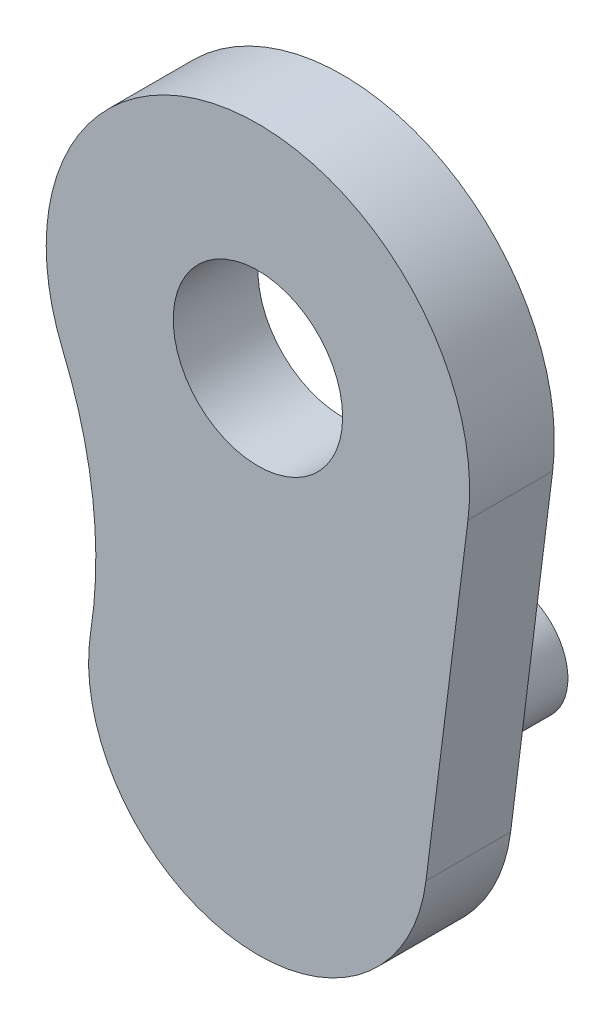
ISO-10303-21;
HEADER;
FILE_DESCRIPTION(('STEP AP214'),'2;1');
FILE_NAME('part.step','',(''),(''),'','','');
FILE_SCHEMA(('AUTOMOTIVE_DESIGN { 1 0 10303 214 1 1 1 1 }'));
ENDSEC;
DATA;
#1=APPLICATION_CONTEXT('core data for automotive mechanical design processes');
#2=APPLICATION_PROTOCOL_DEFINITION('international standard','automotive_design',2000,#1);
#3=PRODUCT_CONTEXT('',#1,'mechanical');
#4=PRODUCT('Part','Part','',(#3));
#5=PRODUCT_RELATED_PRODUCT_CATEGORY('part','',(#4));
#6=PRODUCT_DEFINITION_FORMATION('','',#4);
#7=PRODUCT_DEFINITION_CONTEXT('part definition',#1,'design');
#8=PRODUCT_DEFINITION('design','',#6,#7);
#9=PRODUCT_DEFINITION_SHAPE('','',#8);
#10=(LENGTH_UNIT() NAMED_UNIT(*) SI_UNIT(.MILLI.,.METRE.));
#11=(NAMED_UNIT(*) PLANE_ANGLE_UNIT() SI_UNIT($,.RADIAN.));
#12=(NAMED_UNIT(*) SI_UNIT($,.STERADIAN.) SOLID_ANGLE_UNIT());
#13=UNCERTAINTY_MEASURE_WITH_UNIT(LENGTH_MEASURE(1.E-05),#10,'distance_accuracy_value','');
#14=(GEOMETRIC_REPRESENTATION_CONTEXT(3) GLOBAL_UNCERTAINTY_ASSIGNED_CONTEXT((#13)) GLOBAL_UNIT_ASSIGNED_CONTEXT((#10,
#11,#12)) REPRESENTATION_CONTEXT('',''));
#15=CARTESIAN_POINT('',(0.,0.,0.));
#16=DIRECTION('',(0.,0.,1.));
#17=DIRECTION('',(1.,0.,0.));
#18=AXIS2_PLACEMENT_3D('',#15,#16,#17);
#19=CARTESIAN_POINT('',(-69.1402277530961,-29.0625,10.));
#20=DIRECTION('',(0.,0.,-1.));
#21=DIRECTION('',(-1.,0.,0.));
#22=AXIS2_PLACEMENT_3D('',#19,#20,#21);
#23=PLANE('',#22);
#24=CARTESIAN_POINT('',(-69.1402277530961,-29.0625,10.));
#25=DIRECTION('',(0.,0.,-1.));
#26=DIRECTION('',(-1.,0.,0.));
#27=AXIS2_PLACEMENT_3D('',#24,#25,#26);
#28=CIRCLE('',#27,50.);
#29=CARTESIAN_POINT('',(-23.0467425843654,-9.68749999999997,10.));
#30=VERTEX_POINT('',#29);
#31=CARTESIAN_POINT('',(-19.7543507865989,-36.875,10.));
#32=VERTEX_POINT('',#31);
#33=EDGE_CURVE('E92',#30,#32,#28,.T.);
#34=ORIENTED_EDGE('',*,*,#33,.T.);
#35=CARTESIAN_POINT('',(0.,-40.,10.));
#36=DIRECTION('',(0.,0.,1.));
#37=DIRECTION('',(1.,0.,0.));
#38=AXIS2_PLACEMENT_3D('',#35,#36,#37);
#39=CIRCLE('',#38,20.);
#40=CARTESIAN_POINT('',(19.8431348329844,-42.5,10.));
#41=VERTEX_POINT('',#40);
#42=EDGE_CURVE('E87',#32,#41,#39,.T.);
#43=ORIENTED_EDGE('',*,*,#42,.T.);
#44=DIRECTION('',(0.125,0.992156741649222,0.));
#45=VECTOR('',#44,1.);
#46=CARTESIAN_POINT('',(24.8039185412305,-3.125,10.));
#47=LINE('',#46,#45);
#48=CARTESIAN_POINT('',(24.8039185412305,-3.12500000000001,10.));
#49=VERTEX_POINT('',#48);
#50=EDGE_CURVE('E90',#41,#49,#47,.T.);
#51=ORIENTED_EDGE('',*,*,#50,.T.);
#52=CARTESIAN_POINT('',(0.,0.,10.));
#53=DIRECTION('',(0.,0.,1.));
#54=DIRECTION('',(1.,0.,0.));
#55=AXIS2_PLACEMENT_3D('',#52,#53,#54);
#56=CIRCLE('',#55,25.);
#57=EDGE_CURVE('E57',#49,#30,#56,.T.);
#58=ORIENTED_EDGE('',*,*,#57,.T.);
#59=EDGE_LOOP('',(#34,#43,#51,#58));
#60=FACE_BOUND('',#59,.T.);
#61=CARTESIAN_POINT('',(0.,0.,10.));
#62=DIRECTION('',(0.,0.,1.));
#63=DIRECTION('',(1.,0.,0.));
#64=AXIS2_PLACEMENT_3D('',#61,#62,#63);
#65=CIRCLE('',#64,10.);
#66=CARTESIAN_POINT('',(10.,0.,10.));
#67=VERTEX_POINT('',#66);
#68=EDGE_CURVE('E112',#67,#67,#65,.T.);
#69=ORIENTED_EDGE('',*,*,#68,.F.);
#70=EDGE_LOOP('',(#69));
#71=FACE_BOUND('',#70,.T.);
#72=ADVANCED_FACE('F39',(#60,#71),#23,.F.);
#73=CARTESIAN_POINT('',(-69.1402277530961,-29.0625,0.));
#74=DIRECTION('',(0.,0.,-1.));
#75=DIRECTION('',(-1.,0.,0.));
#76=AXIS2_PLACEMENT_3D('',#73,#74,#75);
#77=PLANE('',#76);
#78=CARTESIAN_POINT('',(0.,-43.4319526427061,0.));
#79=DIRECTION('',(0.,0.,-1.));
#80=DIRECTION('',(-1.,0.,0.));
#81=AXIS2_PLACEMENT_3D('',#78,#79,#80);
#82=CIRCLE('',#81,6.59982996803205);
#83=CARTESIAN_POINT('',(-6.59982996803205,-43.4319526427061,0.));
#84=VERTEX_POINT('',#83);
#85=EDGE_CURVE('E138',#84,#84,#82,.T.);
#86=ORIENTED_EDGE('',*,*,#85,.F.);
#87=EDGE_LOOP('',(#86));
#88=FACE_BOUND('',#87,.T.);
#89=CARTESIAN_POINT('',(-69.1402277530961,-29.0625,0.));
#90=DIRECTION('',(0.,0.,-1.));
#91=DIRECTION('',(-1.,0.,0.));
#92=AXIS2_PLACEMENT_3D('',#89,#90,#91);
#93=CIRCLE('',#92,50.);
#94=CARTESIAN_POINT('',(-23.0467425843654,-9.68749999999997,0.));
#95=VERTEX_POINT('',#94);
#96=CARTESIAN_POINT('',(-19.7543507865989,-36.875,0.));
#97=VERTEX_POINT('',#96);
#98=EDGE_CURVE('E108',#95,#97,#93,.T.);
#99=ORIENTED_EDGE('',*,*,#98,.F.);
#100=CARTESIAN_POINT('',(0.,0.,0.));
#101=DIRECTION('',(0.,0.,1.));
#102=DIRECTION('',(1.,0.,0.));
#103=AXIS2_PLACEMENT_3D('',#100,#101,#102);
#104=CIRCLE('',#103,25.);
#105=CARTESIAN_POINT('',(24.8039185412305,-3.12500000000001,0.));
#106=VERTEX_POINT('',#105);
#107=EDGE_CURVE('E80',#106,#95,#104,.T.);
#108=ORIENTED_EDGE('',*,*,#107,.F.);
#109=DIRECTION('',(0.125,0.992156741649222,0.));
#110=VECTOR('',#109,1.);
#111=CARTESIAN_POINT('',(24.8039185412305,-3.125,0.));
#112=LINE('',#111,#110);
#113=CARTESIAN_POINT('',(19.8431348329844,-42.5,0.));
#114=VERTEX_POINT('',#113);
#115=EDGE_CURVE('E74',#114,#106,#112,.T.);
#116=ORIENTED_EDGE('',*,*,#115,.F.);
#117=CARTESIAN_POINT('',(0.,-40.,0.));
#118=DIRECTION('',(0.,0.,1.));
#119=DIRECTION('',(1.,0.,0.));
#120=AXIS2_PLACEMENT_3D('',#117,#118,#119);
#121=CIRCLE('',#120,20.);
#122=EDGE_CURVE('E97',#97,#114,#121,.T.);
#123=ORIENTED_EDGE('',*,*,#122,.F.);
#124=EDGE_LOOP('',(#99,#108,#116,#123));
#125=FACE_BOUND('',#124,.T.);
#126=CARTESIAN_POINT('',(0.,0.,0.));
#127=DIRECTION('',(0.,0.,1.));
#128=DIRECTION('',(1.,0.,0.));
#129=AXIS2_PLACEMENT_3D('',#126,#127,#128);
#130=CIRCLE('',#129,10.);
#131=CARTESIAN_POINT('',(10.,0.,0.));
#132=VERTEX_POINT('',#131);
#133=EDGE_CURVE('E130',#132,#132,#130,.T.);
#134=ORIENTED_EDGE('',*,*,#133,.T.);
#135=EDGE_LOOP('',(#134));
#136=FACE_BOUND('',#135,.T.);
#137=ADVANCED_FACE('F125',(#88,#125,#136),#77,.T.);
#138=CARTESIAN_POINT('',(-69.1402277530961,-29.0625,10.));
#139=DIRECTION('',(0.,0.,-1.));
#140=DIRECTION('',(-1.,0.,0.));
#141=AXIS2_PLACEMENT_3D('',#138,#139,#140);
#142=CYLINDRICAL_SURFACE('',#141,50.);
#143=ORIENTED_EDGE('',*,*,#98,.T.);
#144=DIRECTION('',(0.,0.,-1.));
#145=VECTOR('',#144,1.);
#146=CARTESIAN_POINT('',(-19.7543507865989,-36.875,10.));
#147=LINE('',#146,#145);
#148=EDGE_CURVE('E11',#32,#97,#147,.T.);
#149=ORIENTED_EDGE('',*,*,#148,.F.);
#150=ORIENTED_EDGE('',*,*,#33,.F.);
#151=DIRECTION('',(0.,0.,-1.));
#152=VECTOR('',#151,1.);
#153=CARTESIAN_POINT('',(-23.0467425843654,-9.68749999999997,10.));
#154=LINE('',#153,#152);
#155=EDGE_CURVE('E104',#30,#95,#154,.T.);
#156=ORIENTED_EDGE('',*,*,#155,.T.);
#157=EDGE_LOOP('',(#143,#149,#150,#156));
#158=FACE_BOUND('',#157,.T.);
#159=ADVANCED_FACE('F41',(#158),#142,.F.);
#160=CARTESIAN_POINT('',(0.,-40.,10.));
#161=DIRECTION('',(0.,0.,-1.));
#162=DIRECTION('',(-1.,0.,0.));
#163=AXIS2_PLACEMENT_3D('',#160,#161,#162);
#164=CYLINDRICAL_SURFACE('',#163,20.);
#165=ORIENTED_EDGE('',*,*,#122,.T.);
#166=DIRECTION('',(0.,0.,-1.));
#167=VECTOR('',#166,1.);
#168=CARTESIAN_POINT('',(19.8431348329844,-42.5,10.));
#169=LINE('',#168,#167);
#170=EDGE_CURVE('E49',#41,#114,#169,.T.);
#171=ORIENTED_EDGE('',*,*,#170,.F.);
#172=ORIENTED_EDGE('',*,*,#42,.F.);
#173=ORIENTED_EDGE('',*,*,#148,.T.);
#174=EDGE_LOOP('',(#165,#171,#172,#173));
#175=FACE_BOUND('',#174,.T.);
#176=ADVANCED_FACE('F96',(#175),#164,.T.);
#177=CARTESIAN_POINT('',(24.8039185412305,-3.125,10.));
#178=DIRECTION('',(-0.992156741649222,0.125,0.));
#179=DIRECTION('',(-0.125,-0.992156741649222,0.));
#180=AXIS2_PLACEMENT_3D('',#177,#178,#179);
#181=PLANE('',#180);
#182=ORIENTED_EDGE('',*,*,#115,.T.);
#183=DIRECTION('',(0.,0.,-1.));
#184=VECTOR('',#183,1.);
#185=CARTESIAN_POINT('',(24.8039185412305,-3.12500000000001,10.));
#186=LINE('',#185,#184);
#187=EDGE_CURVE('E99',#49,#106,#186,.T.);
#188=ORIENTED_EDGE('',*,*,#187,.F.);
#189=ORIENTED_EDGE('',*,*,#50,.F.);
#190=ORIENTED_EDGE('',*,*,#170,.T.);
#191=EDGE_LOOP('',(#182,#188,#189,#190));
#192=FACE_BOUND('',#191,.T.);
#193=ADVANCED_FACE('F100',(#192),#181,.F.);
#194=CARTESIAN_POINT('',(0.,0.,10.));
#195=DIRECTION('',(0.,0.,-1.));
#196=DIRECTION('',(-1.,0.,0.));
#197=AXIS2_PLACEMENT_3D('',#194,#195,#196);
#198=CYLINDRICAL_SURFACE('',#197,25.);
#199=ORIENTED_EDGE('',*,*,#107,.T.);
#200=ORIENTED_EDGE('',*,*,#155,.F.);
#201=ORIENTED_EDGE('',*,*,#57,.F.);
#202=ORIENTED_EDGE('',*,*,#187,.T.);
#203=EDGE_LOOP('',(#199,#200,#201,#202));
#204=FACE_BOUND('',#203,.T.);
#205=ADVANCED_FACE('F122',(#204),#198,.T.);
#206=CARTESIAN_POINT('',(0.,0.,10.));
#207=DIRECTION('',(0.,0.,-1.));
#208=DIRECTION('',(-1.,0.,0.));
#209=AXIS2_PLACEMENT_3D('',#206,#207,#208);
#210=CYLINDRICAL_SURFACE('',#209,10.);
#211=ORIENTED_EDGE('',*,*,#68,.T.);
#212=EDGE_LOOP('',(#211));
#213=FACE_BOUND('',#212,.T.);
#214=ORIENTED_EDGE('',*,*,#133,.F.);
#215=EDGE_LOOP('',(#214));
#216=FACE_BOUND('',#215,.T.);
#217=ADVANCED_FACE('F151',(#213,#216),#210,.F.);
#218=CARTESIAN_POINT('',(0.,-43.4319526427061,-20.));
#219=DIRECTION('',(0.,0.,1.));
#220=DIRECTION('',(1.,0.,0.));
#221=AXIS2_PLACEMENT_3D('',#218,#219,#220);
#222=CYLINDRICAL_SURFACE('',#221,6.59982996803205);
#223=CARTESIAN_POINT('',(0.,-43.4319526427061,-20.));
#224=DIRECTION('',(0.,0.,-1.));
#225=DIRECTION('',(-1.,0.,0.));
#226=AXIS2_PLACEMENT_3D('',#223,#224,#225);
#227=CIRCLE('',#226,6.59982996803205);
#228=CARTESIAN_POINT('',(-6.59982996803205,-43.4319526427061,-20.));
#229=VERTEX_POINT('',#228);
#230=EDGE_CURVE('E134',#229,#229,#227,.T.);
#231=ORIENTED_EDGE('',*,*,#230,.F.);
#232=EDGE_LOOP('',(#231));
#233=FACE_BOUND('',#232,.T.);
#234=ORIENTED_EDGE('',*,*,#85,.T.);
#235=EDGE_LOOP('',(#234));
#236=FACE_BOUND('',#235,.T.);
#237=ADVANCED_FACE('F148',(#233,#236),#222,.T.);
#238=CARTESIAN_POINT('',(0.,-43.4319526427061,-20.));
#239=DIRECTION('',(0.,0.,-1.));
#240=DIRECTION('',(-1.,0.,0.));
#241=AXIS2_PLACEMENT_3D('',#238,#239,#240);
#242=PLANE('',#241);
#243=ORIENTED_EDGE('',*,*,#230,.T.);
#244=EDGE_LOOP('',(#243));
#245=FACE_BOUND('',#244,.T.);
#246=ADVANCED_FACE('F146',(#245),#242,.T.);
#247=CLOSED_SHELL('',(#72,#137,#159,#176,#193,#205,#217,#237,#246));
#248=MANIFOLD_SOLID_BREP('B2',#247);
#249=ADVANCED_BREP_SHAPE_REPRESENTATION('',(#18,#248),#14);
#250=SHAPE_DEFINITION_REPRESENTATION(#9,#249);
ENDSEC;
END-ISO-10303-21;
